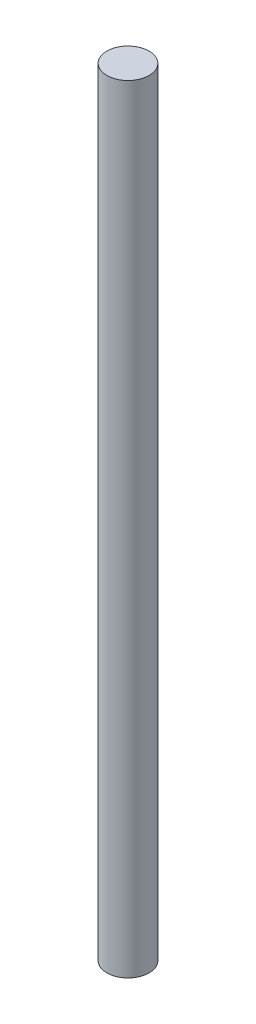
ISO-10303-21;
HEADER;
FILE_DESCRIPTION(('STEP AP214'),'2;1');
FILE_NAME('part.step','',(''),(''),'','','');
FILE_SCHEMA(('AUTOMOTIVE_DESIGN { 1 0 10303 214 1 1 1 1 }'));
ENDSEC;
DATA;
#1=APPLICATION_CONTEXT('core data for automotive mechanical design processes');
#2=APPLICATION_PROTOCOL_DEFINITION('international standard','automotive_design',2000,#1);
#3=PRODUCT_CONTEXT('',#1,'mechanical');
#4=PRODUCT('Part','Part','',(#3));
#5=PRODUCT_RELATED_PRODUCT_CATEGORY('part','',(#4));
#6=PRODUCT_DEFINITION_FORMATION('','',#4);
#7=PRODUCT_DEFINITION_CONTEXT('part definition',#1,'design');
#8=PRODUCT_DEFINITION('design','',#6,#7);
#9=PRODUCT_DEFINITION_SHAPE('','',#8);
#10=(LENGTH_UNIT() NAMED_UNIT(*) SI_UNIT(.MILLI.,.METRE.));
#11=(NAMED_UNIT(*) PLANE_ANGLE_UNIT() SI_UNIT($,.RADIAN.));
#12=(NAMED_UNIT(*) SI_UNIT($,.STERADIAN.) SOLID_ANGLE_UNIT());
#13=UNCERTAINTY_MEASURE_WITH_UNIT(LENGTH_MEASURE(1.E-05),#10,'distance_accuracy_value','');
#14=(GEOMETRIC_REPRESENTATION_CONTEXT(3) GLOBAL_UNCERTAINTY_ASSIGNED_CONTEXT((#13)) GLOBAL_UNIT_ASSIGNED_CONTEXT((#10,
#11,#12)) REPRESENTATION_CONTEXT('',''));
#15=CARTESIAN_POINT('',(0.,0.,0.));
#16=DIRECTION('',(0.,0.,1.));
#17=DIRECTION('',(1.,0.,0.));
#18=AXIS2_PLACEMENT_3D('',#15,#16,#17);
#19=CARTESIAN_POINT('',(-5.32682283546771,147.09,0.));
#20=DIRECTION('',(0.,-1.,0.));
#21=DIRECTION('',(0.,0.,-1.));
#22=AXIS2_PLACEMENT_3D('',#19,#20,#21);
#23=CYLINDRICAL_SURFACE('',#22,4.);
#24=CARTESIAN_POINT('',(-5.32682283546771,147.09,0.));
#25=DIRECTION('',(0.,1.,0.));
#26=DIRECTION('',(0.,0.,1.));
#27=AXIS2_PLACEMENT_3D('',#24,#25,#26);
#28=CIRCLE('',#27,4.);
#29=CARTESIAN_POINT('',(-5.32682283546771,147.09,4.));
#30=VERTEX_POINT('',#29);
#31=EDGE_CURVE('E10',#30,#30,#28,.T.);
#32=ORIENTED_EDGE('',*,*,#31,.F.);
#33=EDGE_LOOP('',(#32));
#34=FACE_BOUND('',#33,.T.);
#35=CARTESIAN_POINT('',(-5.32682283546771,0.,0.));
#36=DIRECTION('',(0.,1.,0.));
#37=DIRECTION('',(0.,0.,1.));
#38=AXIS2_PLACEMENT_3D('',#35,#36,#37);
#39=CIRCLE('',#38,4.);
#40=CARTESIAN_POINT('',(-5.32682283546771,0.,4.));
#41=VERTEX_POINT('',#40);
#42=EDGE_CURVE('E40',#41,#41,#39,.T.);
#43=ORIENTED_EDGE('',*,*,#42,.T.);
#44=EDGE_LOOP('',(#43));
#45=FACE_BOUND('',#44,.T.);
#46=ADVANCED_FACE('F37',(#34,#45),#23,.T.);
#47=CARTESIAN_POINT('',(-5.32682283546771,147.09,0.));
#48=DIRECTION('',(0.,1.,0.));
#49=DIRECTION('',(0.,0.,1.));
#50=AXIS2_PLACEMENT_3D('',#47,#48,#49);
#51=PLANE('',#50);
#52=ORIENTED_EDGE('',*,*,#31,.T.);
#53=EDGE_LOOP('',(#52));
#54=FACE_BOUND('',#53,.T.);
#55=ADVANCED_FACE('F52',(#54),#51,.T.);
#56=CARTESIAN_POINT('',(-5.32682283546771,0.,0.));
#57=DIRECTION('',(0.,1.,0.));
#58=DIRECTION('',(0.,0.,1.));
#59=AXIS2_PLACEMENT_3D('',#56,#57,#58);
#60=PLANE('',#59);
#61=ORIENTED_EDGE('',*,*,#42,.F.);
#62=EDGE_LOOP('',(#61));
#63=FACE_BOUND('',#62,.T.);
#64=ADVANCED_FACE('F50',(#63),#60,.F.);
#65=CLOSED_SHELL('',(#46,#55,#64));
#66=MANIFOLD_SOLID_BREP('B2',#65);
#67=ADVANCED_BREP_SHAPE_REPRESENTATION('',(#18,#66),#14);
#68=SHAPE_DEFINITION_REPRESENTATION(#9,#67);
ENDSEC;
END-ISO-10303-21;
